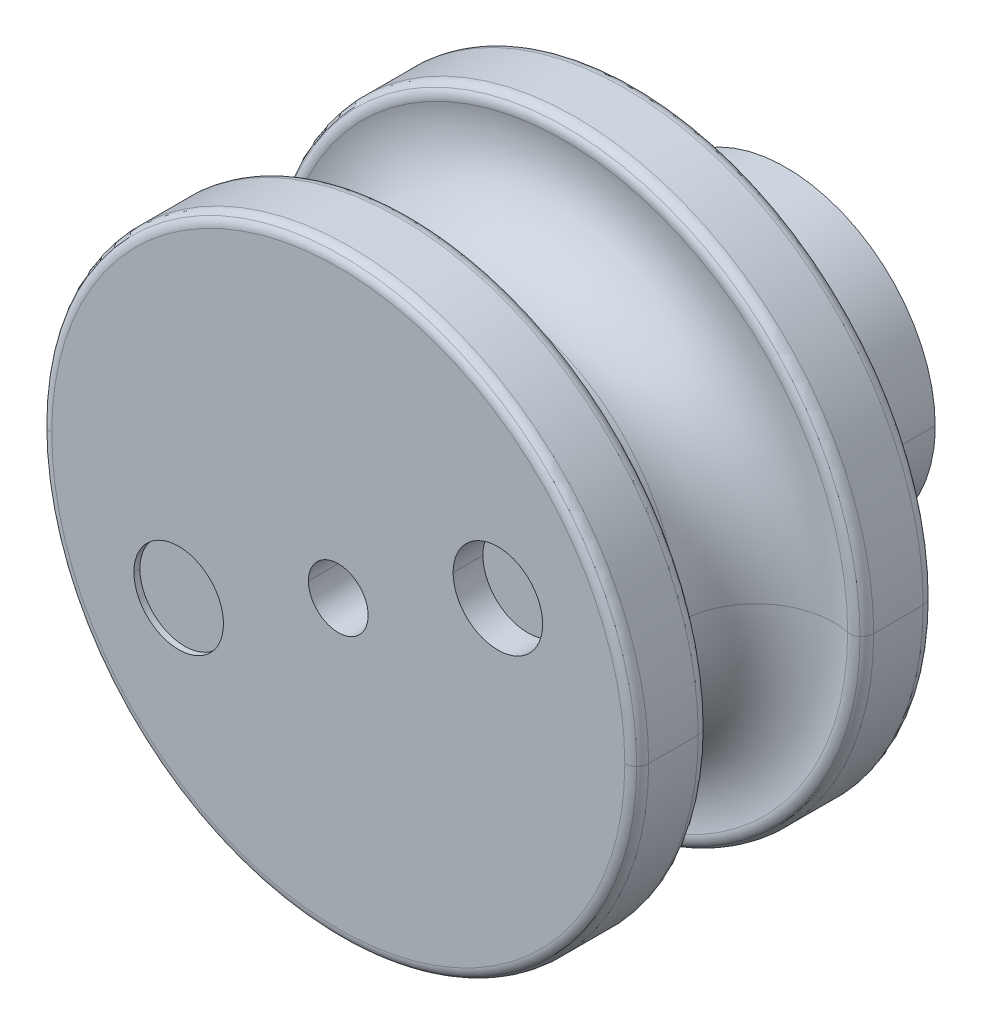
ISO-10303-21;
HEADER;
FILE_DESCRIPTION(('STEP AP214'),'2;1');
FILE_NAME('part.step','',(''),(''),'','','');
FILE_SCHEMA(('AUTOMOTIVE_DESIGN { 1 0 10303 214 1 1 1 1 }'));
ENDSEC;
DATA;
#1=APPLICATION_CONTEXT('core data for automotive mechanical design processes');
#2=APPLICATION_PROTOCOL_DEFINITION('international standard','automotive_design',2000,#1);
#3=PRODUCT_CONTEXT('',#1,'mechanical');
#4=PRODUCT('Part','Part','',(#3));
#5=PRODUCT_RELATED_PRODUCT_CATEGORY('part','',(#4));
#6=PRODUCT_DEFINITION_FORMATION('','',#4);
#7=PRODUCT_DEFINITION_CONTEXT('part definition',#1,'design');
#8=PRODUCT_DEFINITION('design','',#6,#7);
#9=PRODUCT_DEFINITION_SHAPE('','',#8);
#10=(LENGTH_UNIT() NAMED_UNIT(*) SI_UNIT(.MILLI.,.METRE.));
#11=(NAMED_UNIT(*) PLANE_ANGLE_UNIT() SI_UNIT($,.RADIAN.));
#12=(NAMED_UNIT(*) SI_UNIT($,.STERADIAN.) SOLID_ANGLE_UNIT());
#13=UNCERTAINTY_MEASURE_WITH_UNIT(LENGTH_MEASURE(1.E-05),#10,'distance_accuracy_value','');
#14=(GEOMETRIC_REPRESENTATION_CONTEXT(3) GLOBAL_UNCERTAINTY_ASSIGNED_CONTEXT((#13)) GLOBAL_UNIT_ASSIGNED_CONTEXT((#10,
#11,#12)) REPRESENTATION_CONTEXT('',''));
#15=CARTESIAN_POINT('',(0.,0.,0.));
#16=DIRECTION('',(0.,0.,1.));
#17=DIRECTION('',(1.,0.,0.));
#18=AXIS2_PLACEMENT_3D('',#15,#16,#17);
#19=CARTESIAN_POINT('',(0.,0.,-1.5));
#20=DIRECTION('',(0.,0.,1.));
#21=DIRECTION('',(1.,0.,0.));
#22=AXIS2_PLACEMENT_3D('',#19,#20,#21);
#23=CYLINDRICAL_SURFACE('',#22,2.5);
#24=DIRECTION('',(-8.44461455623597E-08,-5.79626799121998E-12,1.));
#25=VECTOR('',#24,1.);
#26=CARTESIAN_POINT('',(2.500000211115,1.450617403358E-11,-2.5));
#27=LINE('',#26,#25);
#28=CARTESIAN_POINT('',(2.500000211115,1.450617403358E-11,-2.5));
#29=VERTEX_POINT('',#28);
#30=CARTESIAN_POINT('',(2.5,0.,0.));
#31=VERTEX_POINT('',#30);
#32=EDGE_CURVE('E11',#29,#31,#27,.T.);
#33=ORIENTED_EDGE('',*,*,#32,.T.);
#34=CARTESIAN_POINT('',(0.,0.,0.));
#35=DIRECTION('',(0.,0.,1.));
#36=DIRECTION('',(0.990268068741566,-0.139173100960095,0.));
#37=AXIS2_PLACEMENT_3D('',#34,#35,#36);
#38=CIRCLE('',#37,2.5);
#39=CARTESIAN_POINT('',(2.475670171854,-0.3479327524001,0.));
#40=VERTEX_POINT('',#39);
#41=EDGE_CURVE('E439',#40,#31,#38,.T.);
#42=ORIENTED_EDGE('',*,*,#41,.F.);
#43=CARTESIAN_POINT('',(0.,0.,0.));
#44=DIRECTION('',(0.,0.,1.));
#45=DIRECTION('',(-1.,0.,0.));
#46=AXIS2_PLACEMENT_3D('',#43,#44,#45);
#47=CIRCLE('',#46,2.5);
#48=CARTESIAN_POINT('',(-2.5,0.,0.));
#49=VERTEX_POINT('',#48);
#50=EDGE_CURVE('E421',#49,#40,#47,.T.);
#51=ORIENTED_EDGE('',*,*,#50,.F.);
#52=DIRECTION('',(8.41470688260782E-08,4.00452907020492E-06,0.999999999991978));
#53=VECTOR('',#52,1.);
#54=CARTESIAN_POINT('',(-2.500000210368,-1.001132266105E-05,-2.5));
#55=LINE('',#54,#53);
#56=CARTESIAN_POINT('',(-2.500000210368,-1.001132266105E-05,-2.5));
#57=VERTEX_POINT('',#56);
#58=EDGE_CURVE('E28',#57,#49,#55,.T.);
#59=ORIENTED_EDGE('',*,*,#58,.F.);
#60=CARTESIAN_POINT('',(0.,0.,-2.5));
#61=DIRECTION('',(0.,0.,-1.));
#62=DIRECTION('',(0.990268068741566,-0.139173100960095,0.));
#63=AXIS2_PLACEMENT_3D('',#60,#61,#62);
#64=CIRCLE('',#63,2.5);
#65=CARTESIAN_POINT('',(2.475670171854,-0.3479327524001,-2.5));
#66=VERTEX_POINT('',#65);
#67=EDGE_CURVE('E282',#66,#57,#64,.T.);
#68=ORIENTED_EDGE('',*,*,#67,.F.);
#69=CARTESIAN_POINT('',(0.,0.,-2.5));
#70=DIRECTION('',(0.,0.,-1.));
#71=DIRECTION('',(1.,1.739059633829E-11,0.));
#72=AXIS2_PLACEMENT_3D('',#69,#70,#71);
#73=CIRCLE('',#72,2.5);
#74=EDGE_CURVE('E342',#29,#66,#73,.T.);
#75=ORIENTED_EDGE('',*,*,#74,.F.);
#76=EDGE_LOOP('',(#33,#42,#51,#59,#68,#75));
#77=FACE_BOUND('',#76,.T.);
#78=ADVANCED_FACE('F17',(#77),#23,.T.);
#79=CARTESIAN_POINT('',(0.,0.,-1.5));
#80=DIRECTION('',(0.,0.,1.));
#81=DIRECTION('',(1.,0.,0.));
#82=AXIS2_PLACEMENT_3D('',#79,#80,#81);
#83=CYLINDRICAL_SURFACE('',#82,2.5);
#84=CARTESIAN_POINT('',(0.,0.,-2.5));
#85=DIRECTION('',(0.,0.,-1.));
#86=DIRECTION('',(-0.999999999927837,-1.20135841769704E-05,0.));
#87=AXIS2_PLACEMENT_3D('',#84,#85,#86);
#88=CIRCLE('',#87,2.5);
#89=CARTESIAN_POINT('',(-2.475670171854,0.3479327524002,-2.5));
#90=VERTEX_POINT('',#89);
#91=EDGE_CURVE('E196',#57,#90,#88,.T.);
#92=ORIENTED_EDGE('',*,*,#91,.F.);
#93=ORIENTED_EDGE('',*,*,#58,.T.);
#94=CARTESIAN_POINT('',(0.,0.,0.));
#95=DIRECTION('',(0.,0.,1.));
#96=DIRECTION('',(1.,0.,0.));
#97=AXIS2_PLACEMENT_3D('',#94,#95,#96);
#98=CIRCLE('',#97,2.5);
#99=EDGE_CURVE('E417',#31,#49,#98,.T.);
#100=ORIENTED_EDGE('',*,*,#99,.F.);
#101=ORIENTED_EDGE('',*,*,#32,.F.);
#102=CARTESIAN_POINT('',(0.,0.,-2.5));
#103=DIRECTION('',(0.,0.,-1.));
#104=DIRECTION('',(-0.990268068741566,0.139173100960095,0.));
#105=AXIS2_PLACEMENT_3D('',#102,#103,#104);
#106=CIRCLE('',#105,2.5);
#107=EDGE_CURVE('E339',#90,#29,#106,.T.);
#108=ORIENTED_EDGE('',*,*,#107,.F.);
#109=EDGE_LOOP('',(#92,#93,#100,#101,#108));
#110=FACE_BOUND('',#109,.T.);
#111=ADVANCED_FACE('F651',(#110),#83,.T.);
#112=CARTESIAN_POINT('',(0.,0.,-2.5));
#113=DIRECTION('',(0.,0.,-1.));
#114=DIRECTION('',(0.,-1.,0.));
#115=AXIS2_PLACEMENT_3D('',#112,#113,#114);
#116=PLANE('',#115);
#117=CARTESIAN_POINT('',(0.,0.,-2.5));
#118=DIRECTION('',(0.,0.,1.));
#119=DIRECTION('',(1.,0.,0.));
#120=AXIS2_PLACEMENT_3D('',#117,#118,#119);
#121=CIRCLE('',#120,0.975);
#122=CARTESIAN_POINT('',(0.975,0.,-2.5));
#123=VERTEX_POINT('',#122);
#124=CARTESIAN_POINT('',(-0.965511367023,0.1356937734361,-2.5));
#125=VERTEX_POINT('',#124);
#126=EDGE_CURVE('E209',#123,#125,#121,.T.);
#127=ORIENTED_EDGE('',*,*,#126,.T.);
#128=CARTESIAN_POINT('',(0.,0.,-2.5));
#129=DIRECTION('',(0.,0.,1.));
#130=DIRECTION('',(-0.990268068741566,0.139173100960095,0.));
#131=AXIS2_PLACEMENT_3D('',#128,#129,#130);
#132=CIRCLE('',#131,0.975);
#133=CARTESIAN_POINT('',(-0.975,0.,-2.5));
#134=VERTEX_POINT('',#133);
#135=EDGE_CURVE('E408',#125,#134,#132,.T.);
#136=ORIENTED_EDGE('',*,*,#135,.T.);
#137=CARTESIAN_POINT('',(0.,0.,-2.5));
#138=DIRECTION('',(0.,0.,1.));
#139=DIRECTION('',(-1.,0.,0.));
#140=AXIS2_PLACEMENT_3D('',#137,#138,#139);
#141=CIRCLE('',#140,0.975);
#142=CARTESIAN_POINT('',(0.965511367023,-0.1356937734361,-2.5));
#143=VERTEX_POINT('',#142);
#144=EDGE_CURVE('E325',#134,#143,#141,.T.);
#145=ORIENTED_EDGE('',*,*,#144,.T.);
#146=CARTESIAN_POINT('',(0.,0.,-2.5));
#147=DIRECTION('',(0.,0.,1.));
#148=DIRECTION('',(0.990268068741566,-0.139173100960095,0.));
#149=AXIS2_PLACEMENT_3D('',#146,#147,#148);
#150=CIRCLE('',#149,0.975);
#151=EDGE_CURVE('E328',#143,#123,#150,.T.);
#152=ORIENTED_EDGE('',*,*,#151,.T.);
#153=EDGE_LOOP('',(#127,#136,#145,#152));
#154=FACE_BOUND('',#153,.T.);
#155=ORIENTED_EDGE('',*,*,#107,.T.);
#156=ORIENTED_EDGE('',*,*,#74,.T.);
#157=ORIENTED_EDGE('',*,*,#67,.T.);
#158=ORIENTED_EDGE('',*,*,#91,.T.);
#159=EDGE_LOOP('',(#155,#156,#157,#158));
#160=FACE_BOUND('',#159,.T.);
#161=ADVANCED_FACE('F656',(#154,#160),#116,.T.);
#162=CARTESIAN_POINT('',(0.,0.,6.5));
#163=DIRECTION('',(0.,0.,-1.));
#164=DIRECTION('',(-1.,0.,0.));
#165=AXIS2_PLACEMENT_3D('',#162,#163,#164);
#166=CYLINDRICAL_SURFACE('',#165,0.975);
#167=DIRECTION('',(0.,0.,-1.));
#168=VECTOR('',#167,1.);
#169=CARTESIAN_POINT('',(-0.975,0.,3.));
#170=LINE('',#169,#168);
#171=CARTESIAN_POINT('',(-0.975,0.,3.));
#172=VERTEX_POINT('',#171);
#173=EDGE_CURVE('E327',#172,#134,#170,.T.);
#174=ORIENTED_EDGE('',*,*,#173,.T.);
#175=ORIENTED_EDGE('',*,*,#135,.F.);
#176=ORIENTED_EDGE('',*,*,#126,.F.);
#177=DIRECTION('',(0.,0.,-1.));
#178=VECTOR('',#177,1.);
#179=CARTESIAN_POINT('',(0.975,0.,3.));
#180=LINE('',#179,#178);
#181=CARTESIAN_POINT('',(0.975,0.,3.));
#182=VERTEX_POINT('',#181);
#183=EDGE_CURVE('E430',#182,#123,#180,.T.);
#184=ORIENTED_EDGE('',*,*,#183,.F.);
#185=CARTESIAN_POINT('',(0.,0.,3.));
#186=DIRECTION('',(0.,0.,-1.));
#187=DIRECTION('',(-1.,0.,0.));
#188=AXIS2_PLACEMENT_3D('',#185,#186,#187);
#189=CIRCLE('',#188,0.975);
#190=EDGE_CURVE('E392',#172,#182,#189,.T.);
#191=ORIENTED_EDGE('',*,*,#190,.F.);
#192=EDGE_LOOP('',(#174,#175,#176,#184,#191));
#193=FACE_BOUND('',#192,.T.);
#194=ADVANCED_FACE('F693',(#193),#166,.F.);
#195=CARTESIAN_POINT('',(0.,0.,6.5));
#196=DIRECTION('',(0.,0.,-1.));
#197=DIRECTION('',(-1.,0.,0.));
#198=AXIS2_PLACEMENT_3D('',#195,#196,#197);
#199=CYLINDRICAL_SURFACE('',#198,0.975);
#200=ORIENTED_EDGE('',*,*,#183,.T.);
#201=ORIENTED_EDGE('',*,*,#151,.F.);
#202=ORIENTED_EDGE('',*,*,#144,.F.);
#203=ORIENTED_EDGE('',*,*,#173,.F.);
#204=CARTESIAN_POINT('',(0.,0.,3.));
#205=DIRECTION('',(0.,0.,-1.));
#206=DIRECTION('',(1.,0.,0.));
#207=AXIS2_PLACEMENT_3D('',#204,#205,#206);
#208=CIRCLE('',#207,0.975);
#209=EDGE_CURVE('E388',#182,#172,#208,.T.);
#210=ORIENTED_EDGE('',*,*,#209,.F.);
#211=EDGE_LOOP('',(#200,#201,#202,#203,#210));
#212=FACE_BOUND('',#211,.T.);
#213=ADVANCED_FACE('F691',(#212),#199,.F.);
#214=CARTESIAN_POINT('',(0.,0.,4.));
#215=DIRECTION('',(0.,0.,1.));
#216=DIRECTION('',(1.,0.,0.));
#217=AXIS2_PLACEMENT_3D('',#214,#215,#216);
#218=CYLINDRICAL_SURFACE('',#217,0.5);
#219=DIRECTION('',(0.,0.,1.));
#220=VECTOR('',#219,1.);
#221=CARTESIAN_POINT('',(0.5,0.,3.));
#222=LINE('',#221,#220);
#223=CARTESIAN_POINT('',(0.5,0.,3.));
#224=VERTEX_POINT('',#223);
#225=CARTESIAN_POINT('',(0.5,0.,5.));
#226=VERTEX_POINT('',#225);
#227=EDGE_CURVE('E533',#224,#226,#222,.T.);
#228=ORIENTED_EDGE('',*,*,#227,.T.);
#229=CARTESIAN_POINT('',(0.,0.,5.));
#230=DIRECTION('',(0.,0.,-1.));
#231=DIRECTION('',(-1.,0.,0.));
#232=AXIS2_PLACEMENT_3D('',#229,#230,#231);
#233=CIRCLE('',#232,0.5);
#234=CARTESIAN_POINT('',(-0.5,0.,5.));
#235=VERTEX_POINT('',#234);
#236=EDGE_CURVE('E368',#235,#226,#233,.T.);
#237=ORIENTED_EDGE('',*,*,#236,.F.);
#238=DIRECTION('',(0.,0.,1.));
#239=VECTOR('',#238,1.);
#240=CARTESIAN_POINT('',(-0.5,0.,3.));
#241=LINE('',#240,#239);
#242=CARTESIAN_POINT('',(-0.5,0.,3.));
#243=VERTEX_POINT('',#242);
#244=EDGE_CURVE('E102',#243,#235,#241,.T.);
#245=ORIENTED_EDGE('',*,*,#244,.F.);
#246=CARTESIAN_POINT('',(0.,0.,3.));
#247=DIRECTION('',(0.,0.,1.));
#248=DIRECTION('',(1.,0.,0.));
#249=AXIS2_PLACEMENT_3D('',#246,#247,#248);
#250=CIRCLE('',#249,0.5);
#251=EDGE_CURVE('E238',#224,#243,#250,.T.);
#252=ORIENTED_EDGE('',*,*,#251,.F.);
#253=EDGE_LOOP('',(#228,#237,#245,#252));
#254=FACE_BOUND('',#253,.T.);
#255=ADVANCED_FACE('F687',(#254),#218,.F.);
#256=CARTESIAN_POINT('',(0.,0.,3.));
#257=DIRECTION('',(0.,0.,1.));
#258=DIRECTION('',(1.,0.,0.));
#259=AXIS2_PLACEMENT_3D('',#256,#257,#258);
#260=PLANE('',#259);
#261=CARTESIAN_POINT('',(0.,0.,3.));
#262=DIRECTION('',(0.,0.,1.));
#263=DIRECTION('',(-1.,0.,0.));
#264=AXIS2_PLACEMENT_3D('',#261,#262,#263);
#265=CIRCLE('',#264,0.5);
#266=EDGE_CURVE('E429',#243,#224,#265,.T.);
#267=ORIENTED_EDGE('',*,*,#266,.T.);
#268=ORIENTED_EDGE('',*,*,#251,.T.);
#269=EDGE_LOOP('',(#267,#268));
#270=FACE_BOUND('',#269,.T.);
#271=ORIENTED_EDGE('',*,*,#190,.T.);
#272=ORIENTED_EDGE('',*,*,#209,.T.);
#273=EDGE_LOOP('',(#271,#272));
#274=FACE_BOUND('',#273,.T.);
#275=ADVANCED_FACE('F690',(#270,#274),#260,.F.);
#276=CARTESIAN_POINT('',(0.,0.,4.));
#277=DIRECTION('',(0.,0.,1.));
#278=DIRECTION('',(1.,0.,0.));
#279=AXIS2_PLACEMENT_3D('',#276,#277,#278);
#280=CYLINDRICAL_SURFACE('',#279,0.5);
#281=ORIENTED_EDGE('',*,*,#244,.T.);
#282=CARTESIAN_POINT('',(0.,0.,5.));
#283=DIRECTION('',(0.,0.,-1.));
#284=DIRECTION('',(1.,0.,0.));
#285=AXIS2_PLACEMENT_3D('',#282,#283,#284);
#286=CIRCLE('',#285,0.5);
#287=EDGE_CURVE('E423',#226,#235,#286,.T.);
#288=ORIENTED_EDGE('',*,*,#287,.F.);
#289=ORIENTED_EDGE('',*,*,#227,.F.);
#290=ORIENTED_EDGE('',*,*,#266,.F.);
#291=EDGE_LOOP('',(#281,#288,#289,#290));
#292=FACE_BOUND('',#291,.T.);
#293=ADVANCED_FACE('F697',(#292),#280,.F.);
#294=CARTESIAN_POINT('',(0.,0.,4.8));
#295=DIRECTION('',(0.,0.,1.));
#296=DIRECTION('',(1.,0.,0.));
#297=AXIS2_PLACEMENT_3D('',#294,#295,#296);
#298=TOROIDAL_SURFACE('',#297,4.8,0.2);
#299=CARTESIAN_POINT('',(4.8,0.,4.8));
#300=DIRECTION('',(0.,-1.,0.));
#301=DIRECTION('',(0.707106781186548,0.,0.707106781186548));
#302=AXIS2_PLACEMENT_3D('',#299,#300,#301);
#303=CIRCLE('',#302,0.2);
#304=CARTESIAN_POINT('',(4.941421356237,0.,4.941421356237));
#305=VERTEX_POINT('',#304);
#306=CARTESIAN_POINT('',(4.8,0.,5.));
#307=VERTEX_POINT('',#306);
#308=EDGE_CURVE('E329',#305,#307,#303,.T.);
#309=ORIENTED_EDGE('',*,*,#308,.F.);
#310=CARTESIAN_POINT('',(0.,0.,4.941421356237));
#311=DIRECTION('',(0.,0.,1.));
#312=DIRECTION('',(1.,0.,0.));
#313=AXIS2_PLACEMENT_3D('',#310,#311,#312);
#314=CIRCLE('',#313,4.941421356237);
#315=CARTESIAN_POINT('',(-4.941421356237,0.,4.941421356237));
#316=VERTEX_POINT('',#315);
#317=EDGE_CURVE('E272',#305,#316,#314,.T.);
#318=ORIENTED_EDGE('',*,*,#317,.T.);
#319=CARTESIAN_POINT('',(-4.8,0.,4.8));
#320=DIRECTION('',(0.,1.,0.));
#321=DIRECTION('',(-0.707106781186548,0.,0.707106781186548));
#322=AXIS2_PLACEMENT_3D('',#319,#320,#321);
#323=CIRCLE('',#322,0.2);
#324=CARTESIAN_POINT('',(-4.8,0.,5.));
#325=VERTEX_POINT('',#324);
#326=EDGE_CURVE('E334',#316,#325,#323,.T.);
#327=ORIENTED_EDGE('',*,*,#326,.T.);
#328=CARTESIAN_POINT('',(0.,0.,5.));
#329=DIRECTION('',(0.,0.,1.));
#330=DIRECTION('',(1.,0.,0.));
#331=AXIS2_PLACEMENT_3D('',#328,#329,#330);
#332=CIRCLE('',#331,4.8);
#333=EDGE_CURVE('E447',#307,#325,#332,.T.);
#334=ORIENTED_EDGE('',*,*,#333,.F.);
#335=EDGE_LOOP('',(#309,#318,#327,#334));
#336=FACE_BOUND('',#335,.T.);
#337=ADVANCED_FACE('F630',(#336),#298,.T.);
#338=CARTESIAN_POINT('',(2.673446241719,1.333878800344,4.5));
#339=DIRECTION('',(0.,0.,1.));
#340=DIRECTION('',(1.,0.,0.));
#341=AXIS2_PLACEMENT_3D('',#338,#339,#340);
#342=CYLINDRICAL_SURFACE('',#341,0.75);
#343=CARTESIAN_POINT('',(2.673446241719,1.333878800344,4.5));
#344=DIRECTION('',(0.,0.,1.));
#345=DIRECTION('',(1.,0.,0.));
#346=AXIS2_PLACEMENT_3D('',#343,#344,#345);
#347=CIRCLE('',#346,0.75);
#348=CARTESIAN_POINT('',(3.423446241719,1.333878800344,4.5));
#349=VERTEX_POINT('',#348);
#350=CARTESIAN_POINT('',(1.930745190163,1.438258626064,4.5));
#351=VERTEX_POINT('',#350);
#352=EDGE_CURVE('E247',#349,#351,#347,.T.);
#353=ORIENTED_EDGE('',*,*,#352,.F.);
#354=DIRECTION('',(0.,0.,1.));
#355=VECTOR('',#354,1.);
#356=CARTESIAN_POINT('',(3.423446241719,1.333878800344,4.5));
#357=LINE('',#356,#355);
#358=CARTESIAN_POINT('',(3.423446241719,1.333878800344,5.));
#359=VERTEX_POINT('',#358);
#360=EDGE_CURVE('E277',#349,#359,#357,.T.);
#361=ORIENTED_EDGE('',*,*,#360,.T.);
#362=CARTESIAN_POINT('',(2.673446241719,1.333878800344,5.));
#363=DIRECTION('',(0.,0.,-1.));
#364=DIRECTION('',(-1.,0.,0.));
#365=AXIS2_PLACEMENT_3D('',#362,#363,#364);
#366=CIRCLE('',#365,0.75);
#367=CARTESIAN_POINT('',(1.923446241719,1.333878800344,5.));
#368=VERTEX_POINT('',#367);
#369=EDGE_CURVE('E451',#368,#359,#366,.T.);
#370=ORIENTED_EDGE('',*,*,#369,.F.);
#371=DIRECTION('',(0.,0.,1.));
#372=VECTOR('',#371,1.);
#373=CARTESIAN_POINT('',(1.923446241719,1.333878800344,4.5));
#374=LINE('',#373,#372);
#375=CARTESIAN_POINT('',(1.923446241719,1.333878800344,4.5));
#376=VERTEX_POINT('',#375);
#377=EDGE_CURVE('E251',#376,#368,#374,.T.);
#378=ORIENTED_EDGE('',*,*,#377,.F.);
#379=CARTESIAN_POINT('',(2.673446241719,1.333878800344,4.5));
#380=DIRECTION('',(0.,0.,1.));
#381=DIRECTION('',(-0.990268068741566,0.139173100960095,0.));
#382=AXIS2_PLACEMENT_3D('',#379,#380,#381);
#383=CIRCLE('',#382,0.75);
#384=EDGE_CURVE('E244',#351,#376,#383,.T.);
#385=ORIENTED_EDGE('',*,*,#384,.F.);
#386=EDGE_LOOP('',(#353,#361,#370,#378,#385));
#387=FACE_BOUND('',#386,.T.);
#388=ADVANCED_FACE('F246',(#387),#342,.F.);
#389=CARTESIAN_POINT('',(2.673446241719,1.333878800344,4.5));
#390=DIRECTION('',(0.,0.,1.));
#391=DIRECTION('',(1.,0.,0.));
#392=AXIS2_PLACEMENT_3D('',#389,#390,#391);
#393=PLANE('',#392);
#394=ORIENTED_EDGE('',*,*,#352,.T.);
#395=ORIENTED_EDGE('',*,*,#384,.T.);
#396=CARTESIAN_POINT('',(2.673446241719,1.333878800344,4.5));
#397=DIRECTION('',(0.,0.,1.));
#398=DIRECTION('',(-1.,0.,0.));
#399=AXIS2_PLACEMENT_3D('',#396,#397,#398);
#400=CIRCLE('',#399,0.75);
#401=CARTESIAN_POINT('',(3.416147293275,1.229498974624,4.5));
#402=VERTEX_POINT('',#401);
#403=EDGE_CURVE('E261',#376,#402,#400,.T.);
#404=ORIENTED_EDGE('',*,*,#403,.T.);
#405=CARTESIAN_POINT('',(2.673446241719,1.333878800344,4.5));
#406=DIRECTION('',(0.,0.,1.));
#407=DIRECTION('',(0.990268068741566,-0.139173100960095,0.));
#408=AXIS2_PLACEMENT_3D('',#405,#406,#407);
#409=CIRCLE('',#408,0.75);
#410=EDGE_CURVE('E258',#402,#349,#409,.T.);
#411=ORIENTED_EDGE('',*,*,#410,.T.);
#412=EDGE_LOOP('',(#394,#395,#404,#411));
#413=FACE_BOUND('',#412,.T.);
#414=ADVANCED_FACE('F256',(#413),#393,.T.);
#415=CARTESIAN_POINT('',(2.673446241719,1.333878800344,4.5));
#416=DIRECTION('',(0.,0.,1.));
#417=DIRECTION('',(1.,0.,0.));
#418=AXIS2_PLACEMENT_3D('',#415,#416,#417);
#419=CYLINDRICAL_SURFACE('',#418,0.75);
#420=ORIENTED_EDGE('',*,*,#377,.T.);
#421=CARTESIAN_POINT('',(2.673446241719,1.333878800344,5.));
#422=DIRECTION('',(0.,0.,-1.));
#423=DIRECTION('',(0.990268068741566,-0.139173100960095,0.));
#424=AXIS2_PLACEMENT_3D('',#421,#422,#423);
#425=CIRCLE('',#424,0.75);
#426=CARTESIAN_POINT('',(3.416147293275,1.229498974624,5.));
#427=VERTEX_POINT('',#426);
#428=EDGE_CURVE('E288',#427,#368,#425,.T.);
#429=ORIENTED_EDGE('',*,*,#428,.F.);
#430=CARTESIAN_POINT('',(2.673446241719,1.333878800344,5.));
#431=DIRECTION('',(0.,0.,-1.));
#432=DIRECTION('',(1.,0.,0.));
#433=AXIS2_PLACEMENT_3D('',#430,#431,#432);
#434=CIRCLE('',#433,0.75);
#435=EDGE_CURVE('E292',#359,#427,#434,.T.);
#436=ORIENTED_EDGE('',*,*,#435,.F.);
#437=ORIENTED_EDGE('',*,*,#360,.F.);
#438=ORIENTED_EDGE('',*,*,#410,.F.);
#439=ORIENTED_EDGE('',*,*,#403,.F.);
#440=EDGE_LOOP('',(#420,#429,#436,#437,#438,#439));
#441=FACE_BOUND('',#440,.T.);
#442=ADVANCED_FACE('F681',(#441),#419,.F.);
#443=CARTESIAN_POINT('',(-2.673446241719,-1.333878800344,4.9));
#444=DIRECTION('',(0.,0.,1.));
#445=DIRECTION('',(1.,0.,0.));
#446=AXIS2_PLACEMENT_3D('',#443,#444,#445);
#447=CYLINDRICAL_SURFACE('',#446,0.75);
#448=DIRECTION('',(0.,0.,1.));
#449=VECTOR('',#448,1.);
#450=CARTESIAN_POINT('',(-1.923446241719,-1.333878800344,4.9));
#451=LINE('',#450,#449);
#452=CARTESIAN_POINT('',(-1.923446241719,-1.333878800344,4.9));
#453=VERTEX_POINT('',#452);
#454=CARTESIAN_POINT('',(-1.923446241719,-1.333878800344,5.));
#455=VERTEX_POINT('',#454);
#456=EDGE_CURVE('E119',#453,#455,#451,.T.);
#457=ORIENTED_EDGE('',*,*,#456,.T.);
#458=CARTESIAN_POINT('',(-2.673446241719,-1.333878800344,5.));
#459=DIRECTION('',(0.,0.,-1.));
#460=DIRECTION('',(-1.,0.,0.));
#461=AXIS2_PLACEMENT_3D('',#458,#459,#460);
#462=CIRCLE('',#461,0.75);
#463=CARTESIAN_POINT('',(-3.423446241719,-1.333878800344,5.));
#464=VERTEX_POINT('',#463);
#465=EDGE_CURVE('E291',#464,#455,#462,.T.);
#466=ORIENTED_EDGE('',*,*,#465,.F.);
#467=DIRECTION('',(0.,0.,1.));
#468=VECTOR('',#467,1.);
#469=CARTESIAN_POINT('',(-3.423446241719,-1.333878800344,4.9));
#470=LINE('',#469,#468);
#471=CARTESIAN_POINT('',(-3.423446241719,-1.333878800344,4.9));
#472=VERTEX_POINT('',#471);
#473=EDGE_CURVE('E363',#472,#464,#470,.T.);
#474=ORIENTED_EDGE('',*,*,#473,.F.);
#475=CARTESIAN_POINT('',(-2.673446241719,-1.333878800344,4.9));
#476=DIRECTION('',(0.,0.,1.));
#477=DIRECTION('',(1.,0.,0.));
#478=AXIS2_PLACEMENT_3D('',#475,#476,#477);
#479=CIRCLE('',#478,0.75);
#480=EDGE_CURVE('E352',#453,#472,#479,.T.);
#481=ORIENTED_EDGE('',*,*,#480,.F.);
#482=EDGE_LOOP('',(#457,#466,#474,#481));
#483=FACE_BOUND('',#482,.T.);
#484=ADVANCED_FACE('F678',(#483),#447,.F.);
#485=CARTESIAN_POINT('',(-2.673446241719,-1.333878800344,4.9));
#486=DIRECTION('',(0.,0.,1.));
#487=DIRECTION('',(1.,0.,0.));
#488=AXIS2_PLACEMENT_3D('',#485,#486,#487);
#489=PLANE('',#488);
#490=CARTESIAN_POINT('',(-2.673446241719,-1.333878800344,4.9));
#491=DIRECTION('',(0.,0.,1.));
#492=DIRECTION('',(-1.,0.,0.));
#493=AXIS2_PLACEMENT_3D('',#490,#491,#492);
#494=CIRCLE('',#493,0.75);
#495=EDGE_CURVE('E356',#472,#453,#494,.T.);
#496=ORIENTED_EDGE('',*,*,#495,.T.);
#497=ORIENTED_EDGE('',*,*,#480,.T.);
#498=EDGE_LOOP('',(#496,#497));
#499=FACE_BOUND('',#498,.T.);
#500=ADVANCED_FACE('F19',(#499),#489,.T.);
#501=CARTESIAN_POINT('',(-2.673446241719,-1.333878800344,4.9));
#502=DIRECTION('',(0.,0.,1.));
#503=DIRECTION('',(1.,0.,0.));
#504=AXIS2_PLACEMENT_3D('',#501,#502,#503);
#505=CYLINDRICAL_SURFACE('',#504,0.75);
#506=ORIENTED_EDGE('',*,*,#473,.T.);
#507=CARTESIAN_POINT('',(-2.673446241719,-1.333878800344,5.));
#508=DIRECTION('',(0.,0.,-1.));
#509=DIRECTION('',(1.,0.,0.));
#510=AXIS2_PLACEMENT_3D('',#507,#508,#509);
#511=CIRCLE('',#510,0.75);
#512=EDGE_CURVE('E364',#455,#464,#511,.T.);
#513=ORIENTED_EDGE('',*,*,#512,.F.);
#514=ORIENTED_EDGE('',*,*,#456,.F.);
#515=ORIENTED_EDGE('',*,*,#495,.F.);
#516=EDGE_LOOP('',(#506,#513,#514,#515));
#517=FACE_BOUND('',#516,.T.);
#518=ADVANCED_FACE('F789',(#517),#505,.F.);
#519=CARTESIAN_POINT('',(0.,0.,5.));
#520=DIRECTION('',(0.,0.,1.));
#521=DIRECTION('',(1.,0.,0.));
#522=AXIS2_PLACEMENT_3D('',#519,#520,#521);
#523=PLANE('',#522);
#524=ORIENTED_EDGE('',*,*,#236,.T.);
#525=ORIENTED_EDGE('',*,*,#287,.T.);
#526=EDGE_LOOP('',(#524,#525));
#527=FACE_BOUND('',#526,.T.);
#528=ORIENTED_EDGE('',*,*,#465,.T.);
#529=ORIENTED_EDGE('',*,*,#512,.T.);
#530=EDGE_LOOP('',(#528,#529));
#531=FACE_BOUND('',#530,.T.);
#532=ORIENTED_EDGE('',*,*,#369,.T.);
#533=ORIENTED_EDGE('',*,*,#435,.T.);
#534=ORIENTED_EDGE('',*,*,#428,.T.);
#535=EDGE_LOOP('',(#532,#533,#534));
#536=FACE_BOUND('',#535,.T.);
#537=CARTESIAN_POINT('',(0.,0.,5.));
#538=DIRECTION('',(0.,0.,1.));
#539=DIRECTION('',(-1.,0.,0.));
#540=AXIS2_PLACEMENT_3D('',#537,#538,#539);
#541=CIRCLE('',#540,4.8);
#542=EDGE_CURVE('E333',#325,#307,#541,.T.);
#543=ORIENTED_EDGE('',*,*,#542,.T.);
#544=ORIENTED_EDGE('',*,*,#333,.T.);
#545=EDGE_LOOP('',(#543,#544));
#546=FACE_BOUND('',#545,.T.);
#547=ADVANCED_FACE('F625',(#527,#531,#536,#546),#523,.T.);
#548=CARTESIAN_POINT('',(0.,0.,4.8));
#549=DIRECTION('',(0.,0.,1.));
#550=DIRECTION('',(1.,0.,0.));
#551=AXIS2_PLACEMENT_3D('',#548,#549,#550);
#552=TOROIDAL_SURFACE('',#551,4.8,0.2);
#553=ORIENTED_EDGE('',*,*,#326,.F.);
#554=CARTESIAN_POINT('',(0.,0.,4.941421356237));
#555=DIRECTION('',(0.,0.,1.));
#556=DIRECTION('',(-1.,0.,0.));
#557=AXIS2_PLACEMENT_3D('',#554,#555,#556);
#558=CIRCLE('',#557,4.941421356237);
#559=EDGE_CURVE('E403',#316,#305,#558,.T.);
#560=ORIENTED_EDGE('',*,*,#559,.T.);
#561=ORIENTED_EDGE('',*,*,#308,.T.);
#562=ORIENTED_EDGE('',*,*,#542,.F.);
#563=EDGE_LOOP('',(#553,#560,#561,#562));
#564=FACE_BOUND('',#563,.T.);
#565=ADVANCED_FACE('F628',(#564),#552,.T.);
#566=CARTESIAN_POINT('',(0.,0.,3.96969384567));
#567=DIRECTION('',(0.,0.,-1.));
#568=DIRECTION('',(-1.,0.,0.));
#569=AXIS2_PLACEMENT_3D('',#566,#567,#568);
#570=TOROIDAL_SURFACE('',#569,4.8,0.2);
#571=CARTESIAN_POINT('',(-4.8,0.,3.96969384567));
#572=DIRECTION('',(0.,-1.,0.));
#573=DIRECTION('',(-1.,0.,0.));
#574=AXIS2_PLACEMENT_3D('',#571,#572,#573);
#575=CIRCLE('',#574,0.2);
#576=CARTESIAN_POINT('',(-5.,0.,3.96969384567));
#577=VERTEX_POINT('',#576);
#578=CARTESIAN_POINT('',(-4.926491106407,0.,3.814774511822));
#579=VERTEX_POINT('',#578);
#580=EDGE_CURVE('E304',#577,#579,#575,.T.);
#581=ORIENTED_EDGE('',*,*,#580,.T.);
#582=CARTESIAN_POINT('',(0.,0.,3.814774511822));
#583=DIRECTION('',(0.,0.,-1.));
#584=DIRECTION('',(1.,0.,0.));
#585=AXIS2_PLACEMENT_3D('',#582,#583,#584);
#586=CIRCLE('',#585,4.926491106407);
#587=CARTESIAN_POINT('',(4.926491106407,0.,3.814774511822));
#588=VERTEX_POINT('',#587);
#589=EDGE_CURVE('E319',#588,#579,#586,.T.);
#590=ORIENTED_EDGE('',*,*,#589,.F.);
#591=CARTESIAN_POINT('',(4.8,0.,3.96969384567));
#592=DIRECTION('',(0.,1.,0.));
#593=DIRECTION('',(1.,0.,0.));
#594=AXIS2_PLACEMENT_3D('',#591,#592,#593);
#595=CIRCLE('',#594,0.2);
#596=CARTESIAN_POINT('',(5.,0.,3.96969384567));
#597=VERTEX_POINT('',#596);
#598=EDGE_CURVE('E295',#597,#588,#595,.T.);
#599=ORIENTED_EDGE('',*,*,#598,.F.);
#600=CARTESIAN_POINT('',(0.,0.,3.96969384567));
#601=DIRECTION('',(0.,0.,-1.));
#602=DIRECTION('',(1.,0.,0.));
#603=AXIS2_PLACEMENT_3D('',#600,#601,#602);
#604=CIRCLE('',#603,5.);
#605=EDGE_CURVE('E376',#597,#577,#604,.T.);
#606=ORIENTED_EDGE('',*,*,#605,.T.);
#607=EDGE_LOOP('',(#581,#590,#599,#606));
#608=FACE_BOUND('',#607,.T.);
#609=ADVANCED_FACE('F513',(#608),#570,.T.);
#610=CARTESIAN_POINT('',(0.,0.,5.));
#611=DIRECTION('',(0.,0.,-1.));
#612=DIRECTION('',(-1.,0.,0.));
#613=AXIS2_PLACEMENT_3D('',#610,#611,#612);
#614=CYLINDRICAL_SURFACE('',#613,5.);
#615=DIRECTION('',(0.,0.,-1.));
#616=VECTOR('',#615,1.);
#617=CARTESIAN_POINT('',(-5.,0.,4.8));
#618=LINE('',#617,#616);
#619=CARTESIAN_POINT('',(-5.,0.,4.8));
#620=VERTEX_POINT('',#619);
#621=EDGE_CURVE('E287',#620,#577,#618,.T.);
#622=ORIENTED_EDGE('',*,*,#621,.T.);
#623=ORIENTED_EDGE('',*,*,#605,.F.);
#624=DIRECTION('',(0.,0.,-1.));
#625=VECTOR('',#624,1.);
#626=CARTESIAN_POINT('',(5.,0.,4.8));
#627=LINE('',#626,#625);
#628=CARTESIAN_POINT('',(5.,0.,4.8));
#629=VERTEX_POINT('',#628);
#630=EDGE_CURVE('E338',#629,#597,#627,.T.);
#631=ORIENTED_EDGE('',*,*,#630,.F.);
#632=CARTESIAN_POINT('',(0.,0.,4.8));
#633=DIRECTION('',(0.,0.,1.));
#634=DIRECTION('',(-1.,0.,0.));
#635=AXIS2_PLACEMENT_3D('',#632,#633,#634);
#636=CIRCLE('',#635,5.);
#637=EDGE_CURVE('E401',#620,#629,#636,.T.);
#638=ORIENTED_EDGE('',*,*,#637,.F.);
#639=EDGE_LOOP('',(#622,#623,#631,#638));
#640=FACE_BOUND('',#639,.T.);
#641=ADVANCED_FACE('F638',(#640),#614,.T.);
#642=CARTESIAN_POINT('',(0.,0.,4.8));
#643=DIRECTION('',(0.,0.,1.));
#644=DIRECTION('',(1.,0.,0.));
#645=AXIS2_PLACEMENT_3D('',#642,#643,#644);
#646=TOROIDAL_SURFACE('',#645,4.8,0.2);
#647=CARTESIAN_POINT('',(4.8,0.,4.8));
#648=DIRECTION('',(0.,-1.,0.));
#649=DIRECTION('',(1.,0.,0.));
#650=AXIS2_PLACEMENT_3D('',#647,#648,#649);
#651=CIRCLE('',#650,0.2);
#652=EDGE_CURVE('E275',#629,#305,#651,.T.);
#653=ORIENTED_EDGE('',*,*,#652,.T.);
#654=ORIENTED_EDGE('',*,*,#559,.F.);
#655=CARTESIAN_POINT('',(-4.8,0.,4.8));
#656=DIRECTION('',(0.,1.,0.));
#657=DIRECTION('',(-1.,0.,0.));
#658=AXIS2_PLACEMENT_3D('',#655,#656,#657);
#659=CIRCLE('',#658,0.2);
#660=EDGE_CURVE('E276',#620,#316,#659,.T.);
#661=ORIENTED_EDGE('',*,*,#660,.F.);
#662=ORIENTED_EDGE('',*,*,#637,.T.);
#663=EDGE_LOOP('',(#653,#654,#661,#662));
#664=FACE_BOUND('',#663,.T.);
#665=ADVANCED_FACE('F637',(#664),#646,.T.);
#666=CARTESIAN_POINT('',(0.,0.,4.8));
#667=DIRECTION('',(0.,0.,1.));
#668=DIRECTION('',(1.,0.,0.));
#669=AXIS2_PLACEMENT_3D('',#666,#667,#668);
#670=TOROIDAL_SURFACE('',#669,4.8,0.2);
#671=ORIENTED_EDGE('',*,*,#660,.T.);
#672=ORIENTED_EDGE('',*,*,#317,.F.);
#673=ORIENTED_EDGE('',*,*,#652,.F.);
#674=CARTESIAN_POINT('',(0.,0.,4.8));
#675=DIRECTION('',(0.,0.,1.));
#676=DIRECTION('',(1.,0.,0.));
#677=AXIS2_PLACEMENT_3D('',#674,#675,#676);
#678=CIRCLE('',#677,5.);
#679=EDGE_CURVE('E283',#629,#620,#678,.T.);
#680=ORIENTED_EDGE('',*,*,#679,.T.);
#681=EDGE_LOOP('',(#671,#672,#673,#680));
#682=FACE_BOUND('',#681,.T.);
#683=ADVANCED_FACE('F635',(#682),#670,.T.);
#684=CARTESIAN_POINT('',(0.,0.,5.));
#685=DIRECTION('',(0.,0.,-1.));
#686=DIRECTION('',(-1.,0.,0.));
#687=AXIS2_PLACEMENT_3D('',#684,#685,#686);
#688=CYLINDRICAL_SURFACE('',#687,5.);
#689=ORIENTED_EDGE('',*,*,#630,.T.);
#690=CARTESIAN_POINT('',(0.,0.,3.96969384567));
#691=DIRECTION('',(0.,0.,-1.));
#692=DIRECTION('',(-1.,0.,0.));
#693=AXIS2_PLACEMENT_3D('',#690,#691,#692);
#694=CIRCLE('',#693,5.);
#695=EDGE_CURVE('E369',#577,#597,#694,.T.);
#696=ORIENTED_EDGE('',*,*,#695,.F.);
#697=ORIENTED_EDGE('',*,*,#621,.F.);
#698=ORIENTED_EDGE('',*,*,#679,.F.);
#699=EDGE_LOOP('',(#689,#696,#697,#698));
#700=FACE_BOUND('',#699,.T.);
#701=ADVANCED_FACE('F505',(#700),#688,.T.);
#702=CARTESIAN_POINT('',(0.,0.,3.96969384567));
#703=DIRECTION('',(0.,0.,-1.));
#704=DIRECTION('',(-1.,0.,0.));
#705=AXIS2_PLACEMENT_3D('',#702,#703,#704);
#706=TOROIDAL_SURFACE('',#705,4.8,0.2);
#707=ORIENTED_EDGE('',*,*,#598,.T.);
#708=CARTESIAN_POINT('',(0.,0.,3.814774511822));
#709=DIRECTION('',(0.,0.,-1.));
#710=DIRECTION('',(-1.,0.,0.));
#711=AXIS2_PLACEMENT_3D('',#708,#709,#710);
#712=CIRCLE('',#711,4.926491106407);
#713=EDGE_CURVE('E296',#579,#588,#712,.T.);
#714=ORIENTED_EDGE('',*,*,#713,.F.);
#715=ORIENTED_EDGE('',*,*,#580,.F.);
#716=ORIENTED_EDGE('',*,*,#695,.T.);
#717=EDGE_LOOP('',(#707,#714,#715,#716));
#718=FACE_BOUND('',#717,.T.);
#719=ADVANCED_FACE('F511',(#718),#706,.T.);
#720=CARTESIAN_POINT('',(0.,0.,2.5));
#721=DIRECTION('',(0.,0.,-1.));
#722=DIRECTION('',(-1.,0.,0.));
#723=AXIS2_PLACEMENT_3D('',#720,#721,#722);
#724=TOROIDAL_SURFACE('',#723,4.5,1.3);
#725=CARTESIAN_POINT('',(4.5,0.,2.5));
#726=DIRECTION('',(0.,1.,0.));
#727=DIRECTION('',(-1.,0.,0.));
#728=AXIS2_PLACEMENT_3D('',#725,#726,#727);
#729=CIRCLE('',#728,1.3);
#730=CARTESIAN_POINT('',(3.2,0.,2.5));
#731=VERTEX_POINT('',#730);
#732=CARTESIAN_POINT('',(4.76,0.,3.773734666247));
#733=VERTEX_POINT('',#732);
#734=EDGE_CURVE('E396',#731,#733,#729,.T.);
#735=ORIENTED_EDGE('',*,*,#734,.F.);
#736=CARTESIAN_POINT('',(0.,0.,2.5));
#737=DIRECTION('',(0.,0.,-1.));
#738=DIRECTION('',(-1.,0.,0.));
#739=AXIS2_PLACEMENT_3D('',#736,#737,#738);
#740=CIRCLE('',#739,3.2);
#741=CARTESIAN_POINT('',(-3.2,0.,2.5));
#742=VERTEX_POINT('',#741);
#743=EDGE_CURVE('E479',#742,#731,#740,.T.);
#744=ORIENTED_EDGE('',*,*,#743,.F.);
#745=CARTESIAN_POINT('',(-4.5,0.,2.5));
#746=DIRECTION('',(0.,-1.,0.));
#747=DIRECTION('',(1.,0.,0.));
#748=AXIS2_PLACEMENT_3D('',#745,#746,#747);
#749=CIRCLE('',#748,1.3);
#750=CARTESIAN_POINT('',(-4.76,0.,3.773734666247));
#751=VERTEX_POINT('',#750);
#752=EDGE_CURVE('E393',#742,#751,#749,.T.);
#753=ORIENTED_EDGE('',*,*,#752,.T.);
#754=CARTESIAN_POINT('',(0.,0.,3.773734666247));
#755=DIRECTION('',(0.,0.,-1.));
#756=DIRECTION('',(-1.,0.,0.));
#757=AXIS2_PLACEMENT_3D('',#754,#755,#756);
#758=CIRCLE('',#757,4.76);
#759=EDGE_CURVE('E293',#751,#733,#758,.T.);
#760=ORIENTED_EDGE('',*,*,#759,.T.);
#761=EDGE_LOOP('',(#735,#744,#753,#760));
#762=FACE_BOUND('',#761,.T.);
#763=ADVANCED_FACE('F686',(#762),#724,.F.);
#764=CARTESIAN_POINT('',(0.,0.,3.96969384567));
#765=DIRECTION('',(0.,0.,-1.));
#766=DIRECTION('',(-1.,0.,0.));
#767=AXIS2_PLACEMENT_3D('',#764,#765,#766);
#768=TOROIDAL_SURFACE('',#767,4.8,0.2);
#769=CARTESIAN_POINT('',(-4.8,0.,3.96969384567));
#770=DIRECTION('',(0.,-1.,0.));
#771=DIRECTION('',(-0.632455532033682,0.,-0.774596669241478));
#772=AXIS2_PLACEMENT_3D('',#769,#770,#771);
#773=CIRCLE('',#772,0.2);
#774=EDGE_CURVE('E308',#579,#751,#773,.T.);
#775=ORIENTED_EDGE('',*,*,#774,.F.);
#776=ORIENTED_EDGE('',*,*,#713,.T.);
#777=CARTESIAN_POINT('',(4.8,0.,3.96969384567));
#778=DIRECTION('',(0.,1.,0.));
#779=DIRECTION('',(0.632455532033682,0.,-0.774596669241478));
#780=AXIS2_PLACEMENT_3D('',#777,#778,#779);
#781=CIRCLE('',#780,0.2);
#782=EDGE_CURVE('E519',#588,#733,#781,.T.);
#783=ORIENTED_EDGE('',*,*,#782,.T.);
#784=ORIENTED_EDGE('',*,*,#759,.F.);
#785=EDGE_LOOP('',(#775,#776,#783,#784));
#786=FACE_BOUND('',#785,.T.);
#787=ADVANCED_FACE('F710',(#786),#768,.T.);
#788=CARTESIAN_POINT('',(0.,0.,3.96969384567));
#789=DIRECTION('',(0.,0.,-1.));
#790=DIRECTION('',(-1.,0.,0.));
#791=AXIS2_PLACEMENT_3D('',#788,#789,#790);
#792=TOROIDAL_SURFACE('',#791,4.8,0.2);
#793=ORIENTED_EDGE('',*,*,#782,.F.);
#794=ORIENTED_EDGE('',*,*,#589,.T.);
#795=ORIENTED_EDGE('',*,*,#774,.T.);
#796=CARTESIAN_POINT('',(0.,0.,3.773734666247));
#797=DIRECTION('',(0.,0.,-1.));
#798=DIRECTION('',(1.,0.,0.));
#799=AXIS2_PLACEMENT_3D('',#796,#797,#798);
#800=CIRCLE('',#799,4.76);
#801=EDGE_CURVE('E524',#733,#751,#800,.T.);
#802=ORIENTED_EDGE('',*,*,#801,.F.);
#803=EDGE_LOOP('',(#793,#794,#795,#802));
#804=FACE_BOUND('',#803,.T.);
#805=ADVANCED_FACE('F522',(#804),#792,.T.);
#806=CARTESIAN_POINT('',(0.,0.,2.5));
#807=DIRECTION('',(0.,0.,-1.));
#808=DIRECTION('',(-1.,0.,0.));
#809=AXIS2_PLACEMENT_3D('',#806,#807,#808);
#810=TOROIDAL_SURFACE('',#809,4.5,1.3);
#811=ORIENTED_EDGE('',*,*,#752,.F.);
#812=CARTESIAN_POINT('',(0.,0.,2.5));
#813=DIRECTION('',(0.,0.,-1.));
#814=DIRECTION('',(1.,0.,0.));
#815=AXIS2_PLACEMENT_3D('',#812,#813,#814);
#816=CIRCLE('',#815,3.2);
#817=EDGE_CURVE('E483',#731,#742,#816,.T.);
#818=ORIENTED_EDGE('',*,*,#817,.F.);
#819=ORIENTED_EDGE('',*,*,#734,.T.);
#820=ORIENTED_EDGE('',*,*,#801,.T.);
#821=EDGE_LOOP('',(#811,#818,#819,#820));
#822=FACE_BOUND('',#821,.T.);
#823=ADVANCED_FACE('F667',(#822),#810,.F.);
#824=CARTESIAN_POINT('',(0.,0.,1.03030615433));
#825=DIRECTION('',(0.,0.,1.));
#826=DIRECTION('',(1.,0.,0.));
#827=AXIS2_PLACEMENT_3D('',#824,#825,#826);
#828=TOROIDAL_SURFACE('',#827,4.8,0.2);
#829=CARTESIAN_POINT('',(-4.8,0.,1.03030615433));
#830=DIRECTION('',(0.,1.,0.));
#831=DIRECTION('',(-0.632455532033682,0.,0.774596669241478));
#832=AXIS2_PLACEMENT_3D('',#829,#830,#831);
#833=CIRCLE('',#832,0.2);
#834=CARTESIAN_POINT('',(-4.926491106407,0.,1.185225488178));
#835=VERTEX_POINT('',#834);
#836=CARTESIAN_POINT('',(-4.76,0.,1.226265333753));
#837=VERTEX_POINT('',#836);
#838=EDGE_CURVE('E350',#835,#837,#833,.T.);
#839=ORIENTED_EDGE('',*,*,#838,.F.);
#840=CARTESIAN_POINT('',(0.,0.,1.185225488178));
#841=DIRECTION('',(0.,0.,1.));
#842=DIRECTION('',(-1.,0.,0.));
#843=AXIS2_PLACEMENT_3D('',#840,#841,#842);
#844=CIRCLE('',#843,4.926491106407);
#845=CARTESIAN_POINT('',(4.926491106407,0.,1.185225488178));
#846=VERTEX_POINT('',#845);
#847=EDGE_CURVE('E560',#835,#846,#844,.T.);
#848=ORIENTED_EDGE('',*,*,#847,.T.);
#849=CARTESIAN_POINT('',(4.8,0.,1.03030615433));
#850=DIRECTION('',(0.,-1.,0.));
#851=DIRECTION('',(0.632455532033682,0.,0.774596669241478));
#852=AXIS2_PLACEMENT_3D('',#849,#850,#851);
#853=CIRCLE('',#852,0.2);
#854=CARTESIAN_POINT('',(4.76,0.,1.226265333753));
#855=VERTEX_POINT('',#854);
#856=EDGE_CURVE('E346',#846,#855,#853,.T.);
#857=ORIENTED_EDGE('',*,*,#856,.T.);
#858=CARTESIAN_POINT('',(0.,0.,1.226265333753));
#859=DIRECTION('',(0.,0.,1.));
#860=DIRECTION('',(-1.,0.,0.));
#861=AXIS2_PLACEMENT_3D('',#858,#859,#860);
#862=CIRCLE('',#861,4.76);
#863=EDGE_CURVE('E397',#837,#855,#862,.T.);
#864=ORIENTED_EDGE('',*,*,#863,.F.);
#865=EDGE_LOOP('',(#839,#848,#857,#864));
#866=FACE_BOUND('',#865,.T.);
#867=ADVANCED_FACE('F670',(#866),#828,.T.);
#868=CARTESIAN_POINT('',(0.,0.,2.5));
#869=DIRECTION('',(0.,0.,-1.));
#870=DIRECTION('',(-1.,0.,0.));
#871=AXIS2_PLACEMENT_3D('',#868,#869,#870);
#872=TOROIDAL_SURFACE('',#871,4.5,1.3);
#873=CARTESIAN_POINT('',(4.5,0.,2.5));
#874=DIRECTION('',(0.,1.,0.));
#875=DIRECTION('',(0.199999999999995,0.,-0.979795897113272));
#876=AXIS2_PLACEMENT_3D('',#873,#874,#875);
#877=CIRCLE('',#876,1.3);
#878=EDGE_CURVE('E323',#855,#731,#877,.T.);
#879=ORIENTED_EDGE('',*,*,#878,.T.);
#880=ORIENTED_EDGE('',*,*,#817,.T.);
#881=CARTESIAN_POINT('',(-4.5,0.,2.5));
#882=DIRECTION('',(0.,-1.,0.));
#883=DIRECTION('',(-0.199999999999995,0.,-0.979795897113272));
#884=AXIS2_PLACEMENT_3D('',#881,#882,#883);
#885=CIRCLE('',#884,1.3);
#886=EDGE_CURVE('E475',#837,#742,#885,.T.);
#887=ORIENTED_EDGE('',*,*,#886,.F.);
#888=ORIENTED_EDGE('',*,*,#863,.T.);
#889=EDGE_LOOP('',(#879,#880,#887,#888));
#890=FACE_BOUND('',#889,.T.);
#891=ADVANCED_FACE('F664',(#890),#872,.F.);
#892=CARTESIAN_POINT('',(0.,0.,2.5));
#893=DIRECTION('',(0.,0.,-1.));
#894=DIRECTION('',(-1.,0.,0.));
#895=AXIS2_PLACEMENT_3D('',#892,#893,#894);
#896=TOROIDAL_SURFACE('',#895,4.5,1.3);
#897=ORIENTED_EDGE('',*,*,#886,.T.);
#898=ORIENTED_EDGE('',*,*,#743,.T.);
#899=ORIENTED_EDGE('',*,*,#878,.F.);
#900=CARTESIAN_POINT('',(0.,0.,1.226265333753));
#901=DIRECTION('',(0.,0.,1.));
#902=DIRECTION('',(1.,0.,0.));
#903=AXIS2_PLACEMENT_3D('',#900,#901,#902);
#904=CIRCLE('',#903,4.76);
#905=EDGE_CURVE('E360',#855,#837,#904,.T.);
#906=ORIENTED_EDGE('',*,*,#905,.T.);
#907=EDGE_LOOP('',(#897,#898,#899,#906));
#908=FACE_BOUND('',#907,.T.);
#909=ADVANCED_FACE('F661',(#908),#896,.F.);
#910=CARTESIAN_POINT('',(0.,0.,1.03030615433));
#911=DIRECTION('',(0.,0.,1.));
#912=DIRECTION('',(1.,0.,0.));
#913=AXIS2_PLACEMENT_3D('',#910,#911,#912);
#914=TOROIDAL_SURFACE('',#913,4.8,0.2);
#915=ORIENTED_EDGE('',*,*,#856,.F.);
#916=CARTESIAN_POINT('',(0.,0.,1.185225488178));
#917=DIRECTION('',(0.,0.,1.));
#918=DIRECTION('',(1.,0.,0.));
#919=AXIS2_PLACEMENT_3D('',#916,#917,#918);
#920=CIRCLE('',#919,4.926491106407);
#921=EDGE_CURVE('E351',#846,#835,#920,.T.);
#922=ORIENTED_EDGE('',*,*,#921,.T.);
#923=ORIENTED_EDGE('',*,*,#838,.T.);
#924=ORIENTED_EDGE('',*,*,#905,.F.);
#925=EDGE_LOOP('',(#915,#922,#923,#924));
#926=FACE_BOUND('',#925,.T.);
#927=ADVANCED_FACE('F663',(#926),#914,.T.);
#928=CARTESIAN_POINT('',(0.,0.,1.03030615433));
#929=DIRECTION('',(0.,0.,1.));
#930=DIRECTION('',(1.,0.,0.));
#931=AXIS2_PLACEMENT_3D('',#928,#929,#930);
#932=TOROIDAL_SURFACE('',#931,4.8,0.2);
#933=CARTESIAN_POINT('',(-4.8,0.,1.03030615433));
#934=DIRECTION('',(0.,1.,0.));
#935=DIRECTION('',(-1.,0.,0.));
#936=AXIS2_PLACEMENT_3D('',#933,#934,#935);
#937=CIRCLE('',#936,0.2);
#938=CARTESIAN_POINT('',(-5.,0.,1.03030615433));
#939=VERTEX_POINT('',#938);
#940=EDGE_CURVE('E544',#939,#835,#937,.T.);
#941=ORIENTED_EDGE('',*,*,#940,.T.);
#942=ORIENTED_EDGE('',*,*,#921,.F.);
#943=CARTESIAN_POINT('',(4.8,0.,1.03030615433));
#944=DIRECTION('',(0.,-1.,0.));
#945=DIRECTION('',(1.,0.,0.));
#946=AXIS2_PLACEMENT_3D('',#943,#944,#945);
#947=CIRCLE('',#946,0.2);
#948=CARTESIAN_POINT('',(5.,0.,1.03030615433));
#949=VERTEX_POINT('',#948);
#950=EDGE_CURVE('E565',#949,#846,#947,.T.);
#951=ORIENTED_EDGE('',*,*,#950,.F.);
#952=CARTESIAN_POINT('',(0.,0.,1.03030615433));
#953=DIRECTION('',(0.,0.,1.));
#954=DIRECTION('',(1.,0.,0.));
#955=AXIS2_PLACEMENT_3D('',#952,#953,#954);
#956=CIRCLE('',#955,5.);
#957=EDGE_CURVE('E545',#949,#939,#956,.T.);
#958=ORIENTED_EDGE('',*,*,#957,.T.);
#959=EDGE_LOOP('',(#941,#942,#951,#958));
#960=FACE_BOUND('',#959,.T.);
#961=ADVANCED_FACE('F704',(#960),#932,.T.);
#962=CARTESIAN_POINT('',(0.,0.,1.03030615433));
#963=DIRECTION('',(0.,0.,1.));
#964=DIRECTION('',(1.,0.,0.));
#965=AXIS2_PLACEMENT_3D('',#962,#963,#964);
#966=TOROIDAL_SURFACE('',#965,4.8,0.2);
#967=ORIENTED_EDGE('',*,*,#950,.T.);
#968=ORIENTED_EDGE('',*,*,#847,.F.);
#969=ORIENTED_EDGE('',*,*,#940,.F.);
#970=CARTESIAN_POINT('',(0.,0.,1.03030615433));
#971=DIRECTION('',(0.,0.,1.));
#972=DIRECTION('',(-1.,0.,0.));
#973=AXIS2_PLACEMENT_3D('',#970,#971,#972);
#974=CIRCLE('',#973,5.);
#975=EDGE_CURVE('E434',#939,#949,#974,.T.);
#976=ORIENTED_EDGE('',*,*,#975,.T.);
#977=EDGE_LOOP('',(#967,#968,#969,#976));
#978=FACE_BOUND('',#977,.T.);
#979=ADVANCED_FACE('F700',(#978),#966,.T.);
#980=CARTESIAN_POINT('',(0.,0.,0.2));
#981=DIRECTION('',(0.,0.,1.));
#982=DIRECTION('',(1.,0.,0.));
#983=AXIS2_PLACEMENT_3D('',#980,#981,#982);
#984=TOROIDAL_SURFACE('',#983,4.8,0.2);
#985=CARTESIAN_POINT('',(-4.8,0.,0.2));
#986=DIRECTION('',(0.,1.,0.));
#987=DIRECTION('',(-0.707106781186548,0.,-0.707106781186548));
#988=AXIS2_PLACEMENT_3D('',#985,#986,#987);
#989=CIRCLE('',#988,0.2);
#990=CARTESIAN_POINT('',(-4.941421356237,0.,0.05857864376269));
#991=VERTEX_POINT('',#990);
#992=CARTESIAN_POINT('',(-5.,0.,0.2));
#993=VERTEX_POINT('',#992);
#994=EDGE_CURVE('E413',#991,#993,#989,.T.);
#995=ORIENTED_EDGE('',*,*,#994,.F.);
#996=CARTESIAN_POINT('',(0.,0.,0.05857864376269));
#997=DIRECTION('',(0.,0.,1.));
#998=DIRECTION('',(-1.,0.,0.));
#999=AXIS2_PLACEMENT_3D('',#996,#997,#998);
#1000=CIRCLE('',#999,4.941421356237);
#1001=CARTESIAN_POINT('',(4.941421356237,0.,0.05857864376269));
#1002=VERTEX_POINT('',#1001);
#1003=EDGE_CURVE('E382',#991,#1002,#1000,.T.);
#1004=ORIENTED_EDGE('',*,*,#1003,.T.);
#1005=CARTESIAN_POINT('',(4.8,0.,0.2));
#1006=DIRECTION('',(0.,-1.,0.));
#1007=DIRECTION('',(0.707106781186548,0.,-0.707106781186548));
#1008=AXIS2_PLACEMENT_3D('',#1005,#1006,#1007);
#1009=CIRCLE('',#1008,0.2);
#1010=CARTESIAN_POINT('',(5.,0.,0.2));
#1011=VERTEX_POINT('',#1010);
#1012=EDGE_CURVE('E409',#1002,#1011,#1009,.T.);
#1013=ORIENTED_EDGE('',*,*,#1012,.T.);
#1014=CARTESIAN_POINT('',(0.,0.,0.2));
#1015=DIRECTION('',(0.,0.,-1.));
#1016=DIRECTION('',(1.,0.,0.));
#1017=AXIS2_PLACEMENT_3D('',#1014,#1015,#1016);
#1018=CIRCLE('',#1017,5.);
#1019=EDGE_CURVE('E438',#1011,#993,#1018,.T.);
#1020=ORIENTED_EDGE('',*,*,#1019,.T.);
#1021=EDGE_LOOP('',(#995,#1004,#1013,#1020));
#1022=FACE_BOUND('',#1021,.T.);
#1023=ADVANCED_FACE('F703',(#1022),#984,.T.);
#1024=CARTESIAN_POINT('',(0.,0.,5.));
#1025=DIRECTION('',(0.,0.,-1.));
#1026=DIRECTION('',(-1.,0.,0.));
#1027=AXIS2_PLACEMENT_3D('',#1024,#1025,#1026);
#1028=CYLINDRICAL_SURFACE('',#1027,5.);
#1029=DIRECTION('',(0.,0.,-1.));
#1030=VECTOR('',#1029,1.);
#1031=CARTESIAN_POINT('',(5.,0.,1.03030615433));
#1032=LINE('',#1031,#1030);
#1033=EDGE_CURVE('E21',#949,#1011,#1032,.T.);
#1034=ORIENTED_EDGE('',*,*,#1033,.F.);
#1035=ORIENTED_EDGE('',*,*,#975,.F.);
#1036=DIRECTION('',(0.,0.,-1.));
#1037=VECTOR('',#1036,1.);
#1038=CARTESIAN_POINT('',(-5.,0.,1.03030615433));
#1039=LINE('',#1038,#1037);
#1040=EDGE_CURVE('E270',#939,#993,#1039,.T.);
#1041=ORIENTED_EDGE('',*,*,#1040,.T.);
#1042=ORIENTED_EDGE('',*,*,#1019,.F.);
#1043=EDGE_LOOP('',(#1034,#1035,#1041,#1042));
#1044=FACE_BOUND('',#1043,.T.);
#1045=ADVANCED_FACE('F676',(#1044),#1028,.T.);
#1046=CARTESIAN_POINT('',(0.,0.,5.));
#1047=DIRECTION('',(0.,0.,-1.));
#1048=DIRECTION('',(-1.,0.,0.));
#1049=AXIS2_PLACEMENT_3D('',#1046,#1047,#1048);
#1050=CYLINDRICAL_SURFACE('',#1049,5.);
#1051=ORIENTED_EDGE('',*,*,#1040,.F.);
#1052=ORIENTED_EDGE('',*,*,#957,.F.);
#1053=ORIENTED_EDGE('',*,*,#1033,.T.);
#1054=CARTESIAN_POINT('',(0.,0.,0.2));
#1055=DIRECTION('',(0.,0.,-1.));
#1056=DIRECTION('',(-1.,0.,0.));
#1057=AXIS2_PLACEMENT_3D('',#1054,#1055,#1056);
#1058=CIRCLE('',#1057,5.);
#1059=EDGE_CURVE('E460',#993,#1011,#1058,.T.);
#1060=ORIENTED_EDGE('',*,*,#1059,.F.);
#1061=EDGE_LOOP('',(#1051,#1052,#1053,#1060));
#1062=FACE_BOUND('',#1061,.T.);
#1063=ADVANCED_FACE('F672',(#1062),#1050,.T.);
#1064=CARTESIAN_POINT('',(0.,0.,0.2));
#1065=DIRECTION('',(0.,0.,1.));
#1066=DIRECTION('',(1.,0.,0.));
#1067=AXIS2_PLACEMENT_3D('',#1064,#1065,#1066);
#1068=TOROIDAL_SURFACE('',#1067,4.8,0.2);
#1069=ORIENTED_EDGE('',*,*,#1012,.F.);
#1070=CARTESIAN_POINT('',(0.,0.,0.05857864376269));
#1071=DIRECTION('',(0.,0.,1.));
#1072=DIRECTION('',(1.,0.,0.));
#1073=AXIS2_PLACEMENT_3D('',#1070,#1071,#1072);
#1074=CIRCLE('',#1073,4.941421356237);
#1075=EDGE_CURVE('E381',#1002,#991,#1074,.T.);
#1076=ORIENTED_EDGE('',*,*,#1075,.T.);
#1077=ORIENTED_EDGE('',*,*,#994,.T.);
#1078=ORIENTED_EDGE('',*,*,#1059,.T.);
#1079=EDGE_LOOP('',(#1069,#1076,#1077,#1078));
#1080=FACE_BOUND('',#1079,.T.);
#1081=ADVANCED_FACE('F675',(#1080),#1068,.T.);
#1082=CARTESIAN_POINT('',(0.,0.,0.2));
#1083=DIRECTION('',(0.,0.,1.));
#1084=DIRECTION('',(1.,0.,0.));
#1085=AXIS2_PLACEMENT_3D('',#1082,#1083,#1084);
#1086=TOROIDAL_SURFACE('',#1085,4.8,0.2);
#1087=CARTESIAN_POINT('',(-4.8,0.,0.2));
#1088=DIRECTION('',(0.,1.,0.));
#1089=DIRECTION('',(0.,0.,-1.));
#1090=AXIS2_PLACEMENT_3D('',#1087,#1088,#1089);
#1091=CIRCLE('',#1090,0.2);
#1092=CARTESIAN_POINT('',(-4.8,0.,0.));
#1093=VERTEX_POINT('',#1092);
#1094=EDGE_CURVE('E377',#1093,#991,#1091,.T.);
#1095=ORIENTED_EDGE('',*,*,#1094,.T.);
#1096=ORIENTED_EDGE('',*,*,#1075,.F.);
#1097=CARTESIAN_POINT('',(4.8,0.,0.2));
#1098=DIRECTION('',(0.,-1.,0.));
#1099=DIRECTION('',(0.,0.,-1.));
#1100=AXIS2_PLACEMENT_3D('',#1097,#1098,#1099);
#1101=CIRCLE('',#1100,0.2);
#1102=CARTESIAN_POINT('',(4.8,0.,0.));
#1103=VERTEX_POINT('',#1102);
#1104=EDGE_CURVE('E443',#1103,#1002,#1101,.T.);
#1105=ORIENTED_EDGE('',*,*,#1104,.F.);
#1106=CARTESIAN_POINT('',(0.,0.,0.));
#1107=DIRECTION('',(0.,0.,-1.));
#1108=DIRECTION('',(-1.,0.,0.));
#1109=AXIS2_PLACEMENT_3D('',#1106,#1107,#1108);
#1110=CIRCLE('',#1109,4.8);
#1111=EDGE_CURVE('E487',#1093,#1103,#1110,.T.);
#1112=ORIENTED_EDGE('',*,*,#1111,.F.);
#1113=EDGE_LOOP('',(#1095,#1096,#1105,#1112));
#1114=FACE_BOUND('',#1113,.T.);
#1115=ADVANCED_FACE('F605',(#1114),#1086,.T.);
#1116=CARTESIAN_POINT('',(0.,0.,0.2));
#1117=DIRECTION('',(0.,0.,1.));
#1118=DIRECTION('',(1.,0.,0.));
#1119=AXIS2_PLACEMENT_3D('',#1116,#1117,#1118);
#1120=TOROIDAL_SURFACE('',#1119,4.8,0.2);
#1121=ORIENTED_EDGE('',*,*,#1104,.T.);
#1122=ORIENTED_EDGE('',*,*,#1003,.F.);
#1123=ORIENTED_EDGE('',*,*,#1094,.F.);
#1124=CARTESIAN_POINT('',(0.,0.,0.));
#1125=DIRECTION('',(0.,0.,-1.));
#1126=DIRECTION('',(1.,0.,0.));
#1127=AXIS2_PLACEMENT_3D('',#1124,#1125,#1126);
#1128=CIRCLE('',#1127,4.8);
#1129=EDGE_CURVE('E422',#1103,#1093,#1128,.T.);
#1130=ORIENTED_EDGE('',*,*,#1129,.F.);
#1131=EDGE_LOOP('',(#1121,#1122,#1123,#1130));
#1132=FACE_BOUND('',#1131,.T.);
#1133=ADVANCED_FACE('F598',(#1132),#1120,.T.);
#1134=CARTESIAN_POINT('',(0.,0.,0.));
#1135=DIRECTION('',(0.,0.,1.));
#1136=DIRECTION('',(1.,0.,0.));
#1137=AXIS2_PLACEMENT_3D('',#1134,#1135,#1136);
#1138=PLANE('',#1137);
#1139=ORIENTED_EDGE('',*,*,#99,.T.);
#1140=ORIENTED_EDGE('',*,*,#50,.T.);
#1141=ORIENTED_EDGE('',*,*,#41,.T.);
#1142=EDGE_LOOP('',(#1139,#1140,#1141));
#1143=FACE_BOUND('',#1142,.T.);
#1144=ORIENTED_EDGE('',*,*,#1111,.T.);
#1145=ORIENTED_EDGE('',*,*,#1129,.T.);
#1146=EDGE_LOOP('',(#1144,#1145));
#1147=FACE_BOUND('',#1146,.T.);
#1148=ADVANCED_FACE('F716',(#1143,#1147),#1138,.F.);
#1149=CLOSED_SHELL('',(#78,#111,#161,#194,#213,#255,#275,#293,#337,#388,#414,#442,#484,#500,
#518,#547,#565,#609,#641,#665,#683,#701,#719,#763,#787,#805,#823,#867,#891,#909,#927,#961,#979,
#1023,#1045,#1063,#1081,#1115,#1133,#1148));
#1150=MANIFOLD_SOLID_BREP('B1',#1149);
#1151=ADVANCED_BREP_SHAPE_REPRESENTATION('',(#18,#1150),#14);
#1152=SHAPE_DEFINITION_REPRESENTATION(#9,#1151);
ENDSEC;
END-ISO-10303-21;
